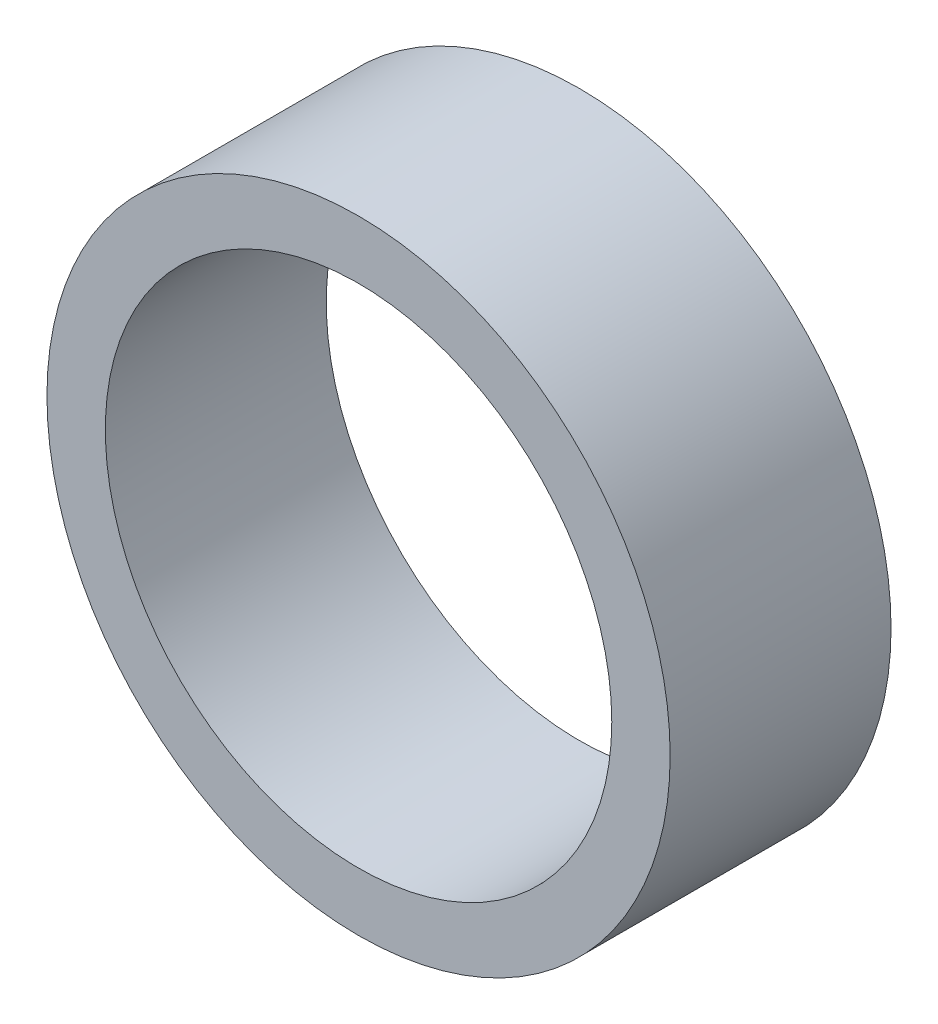
ISO-10303-21;
HEADER;
FILE_DESCRIPTION(('STEP AP214'),'2;1');
FILE_NAME('part.step','',(''),(''),'','','');
FILE_SCHEMA(('AUTOMOTIVE_DESIGN { 1 0 10303 214 1 1 1 1 }'));
ENDSEC;
DATA;
#1=APPLICATION_CONTEXT('core data for automotive mechanical design processes');
#2=APPLICATION_PROTOCOL_DEFINITION('international standard','automotive_design',2000,#1);
#3=PRODUCT_CONTEXT('',#1,'mechanical');
#4=PRODUCT('Part','Part','',(#3));
#5=PRODUCT_RELATED_PRODUCT_CATEGORY('part','',(#4));
#6=PRODUCT_DEFINITION_FORMATION('','',#4);
#7=PRODUCT_DEFINITION_CONTEXT('part definition',#1,'design');
#8=PRODUCT_DEFINITION('design','',#6,#7);
#9=PRODUCT_DEFINITION_SHAPE('','',#8);
#10=(LENGTH_UNIT() NAMED_UNIT(*) SI_UNIT(.MILLI.,.METRE.));
#11=(NAMED_UNIT(*) PLANE_ANGLE_UNIT() SI_UNIT($,.RADIAN.));
#12=(NAMED_UNIT(*) SI_UNIT($,.STERADIAN.) SOLID_ANGLE_UNIT());
#13=UNCERTAINTY_MEASURE_WITH_UNIT(LENGTH_MEASURE(1.E-05),#10,'distance_accuracy_value','');
#14=(GEOMETRIC_REPRESENTATION_CONTEXT(3) GLOBAL_UNCERTAINTY_ASSIGNED_CONTEXT((#13)) GLOBAL_UNIT_ASSIGNED_CONTEXT((#10,
#11,#12)) REPRESENTATION_CONTEXT('',''));
#15=CARTESIAN_POINT('',(0.,0.,0.));
#16=DIRECTION('',(0.,0.,1.));
#17=DIRECTION('',(1.,0.,0.));
#18=AXIS2_PLACEMENT_3D('',#15,#16,#17);
#19=CARTESIAN_POINT('',(44.7910417361506,4.5547746146587,28.));
#20=DIRECTION('',(0.,0.,1.));
#21=DIRECTION('',(1.,0.,0.));
#22=AXIS2_PLACEMENT_3D('',#19,#20,#21);
#23=PLANE('',#22);
#24=CARTESIAN_POINT('',(44.7910417361506,4.5547746146587,28.));
#25=DIRECTION('',(0.,0.,1.));
#26=DIRECTION('',(1.,0.,0.));
#27=AXIS2_PLACEMENT_3D('',#24,#25,#26);
#28=CIRCLE('',#27,39.5);
#29=CARTESIAN_POINT('',(84.2910417361506,4.5547746146587,28.));
#30=VERTEX_POINT('',#29);
#31=EDGE_CURVE('E10',#30,#30,#28,.T.);
#32=ORIENTED_EDGE('',*,*,#31,.T.);
#33=EDGE_LOOP('',(#32));
#34=FACE_BOUND('',#33,.T.);
#35=CARTESIAN_POINT('',(44.7910417361506,4.5547746146587,28.));
#36=DIRECTION('',(0.,0.,1.));
#37=DIRECTION('',(1.,0.,0.));
#38=AXIS2_PLACEMENT_3D('',#35,#36,#37);
#39=CIRCLE('',#38,32.1);
#40=CARTESIAN_POINT('',(76.8910417361505,4.5547746146587,28.));
#41=VERTEX_POINT('',#40);
#42=EDGE_CURVE('E54',#41,#41,#39,.T.);
#43=ORIENTED_EDGE('',*,*,#42,.F.);
#44=EDGE_LOOP('',(#43));
#45=FACE_BOUND('',#44,.T.);
#46=ADVANCED_FACE('F43',(#34,#45),#23,.T.);
#47=CARTESIAN_POINT('',(44.7910417361506,4.5547746146587,0.));
#48=DIRECTION('',(0.,0.,1.));
#49=DIRECTION('',(1.,0.,0.));
#50=AXIS2_PLACEMENT_3D('',#47,#48,#49);
#51=PLANE('',#50);
#52=CARTESIAN_POINT('',(44.7910417361506,4.5547746146587,0.));
#53=DIRECTION('',(0.,0.,1.));
#54=DIRECTION('',(1.,0.,0.));
#55=AXIS2_PLACEMENT_3D('',#52,#53,#54);
#56=CIRCLE('',#55,39.5);
#57=CARTESIAN_POINT('',(84.2910417361506,4.5547746146587,0.));
#58=VERTEX_POINT('',#57);
#59=EDGE_CURVE('E47',#58,#58,#56,.T.);
#60=ORIENTED_EDGE('',*,*,#59,.F.);
#61=EDGE_LOOP('',(#60));
#62=FACE_BOUND('',#61,.T.);
#63=CARTESIAN_POINT('',(44.7910417361506,4.5547746146587,0.));
#64=DIRECTION('',(0.,0.,1.));
#65=DIRECTION('',(1.,0.,0.));
#66=AXIS2_PLACEMENT_3D('',#63,#64,#65);
#67=CIRCLE('',#66,32.1);
#68=CARTESIAN_POINT('',(76.8910417361505,4.5547746146587,0.));
#69=VERTEX_POINT('',#68);
#70=EDGE_CURVE('E56',#69,#69,#67,.T.);
#71=ORIENTED_EDGE('',*,*,#70,.T.);
#72=EDGE_LOOP('',(#71));
#73=FACE_BOUND('',#72,.T.);
#74=ADVANCED_FACE('F66',(#62,#73),#51,.F.);
#75=CARTESIAN_POINT('',(44.7910417361506,4.5547746146587,28.));
#76=DIRECTION('',(0.,0.,-1.));
#77=DIRECTION('',(-1.,0.,0.));
#78=AXIS2_PLACEMENT_3D('',#75,#76,#77);
#79=CYLINDRICAL_SURFACE('',#78,39.5);
#80=ORIENTED_EDGE('',*,*,#31,.F.);
#81=EDGE_LOOP('',(#80));
#82=FACE_BOUND('',#81,.T.);
#83=ORIENTED_EDGE('',*,*,#59,.T.);
#84=EDGE_LOOP('',(#83));
#85=FACE_BOUND('',#84,.T.);
#86=ADVANCED_FACE('F45',(#82,#85),#79,.T.);
#87=CARTESIAN_POINT('',(44.7910417361506,4.5547746146587,28.));
#88=DIRECTION('',(0.,0.,-1.));
#89=DIRECTION('',(-1.,0.,0.));
#90=AXIS2_PLACEMENT_3D('',#87,#88,#89);
#91=CYLINDRICAL_SURFACE('',#90,32.1);
#92=ORIENTED_EDGE('',*,*,#42,.T.);
#93=EDGE_LOOP('',(#92));
#94=FACE_BOUND('',#93,.T.);
#95=ORIENTED_EDGE('',*,*,#70,.F.);
#96=EDGE_LOOP('',(#95));
#97=FACE_BOUND('',#96,.T.);
#98=ADVANCED_FACE('F62',(#94,#97),#91,.F.);
#99=CLOSED_SHELL('',(#46,#74,#86,#98));
#100=MANIFOLD_SOLID_BREP('B2',#99);
#101=ADVANCED_BREP_SHAPE_REPRESENTATION('',(#18,#100),#14);
#102=SHAPE_DEFINITION_REPRESENTATION(#9,#101);
ENDSEC;
END-ISO-10303-21;
